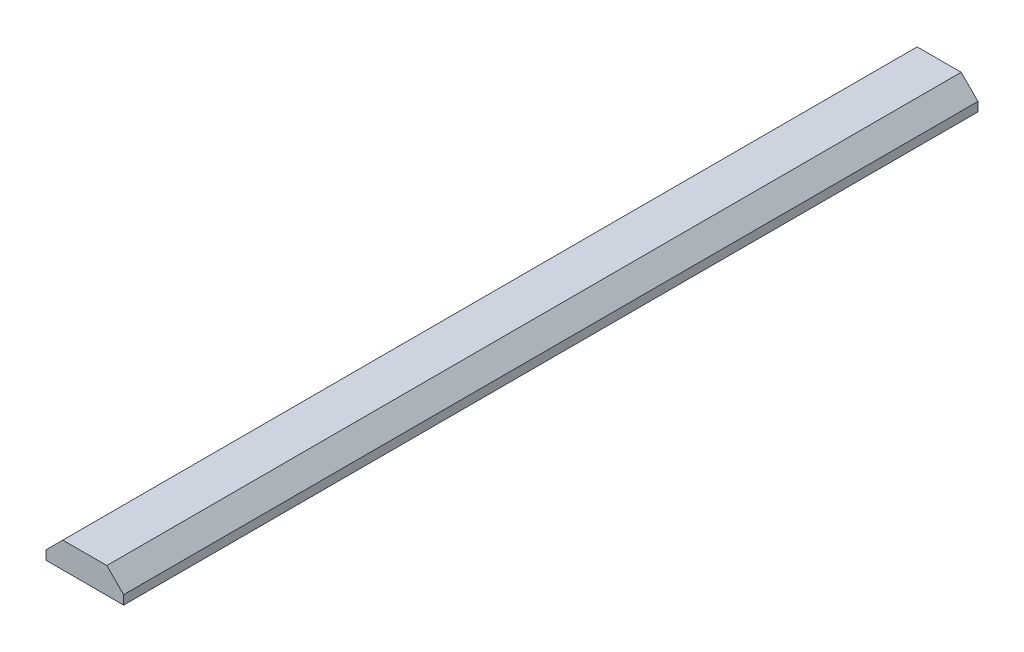
ISO-10303-21;
HEADER;
FILE_DESCRIPTION(('STEP AP214'),'2;1');
FILE_NAME('part.step','',(''),(''),'','','');
FILE_SCHEMA(('AUTOMOTIVE_DESIGN { 1 0 10303 214 1 1 1 1 }'));
ENDSEC;
DATA;
#1=APPLICATION_CONTEXT('core data for automotive mechanical design processes');
#2=APPLICATION_PROTOCOL_DEFINITION('international standard','automotive_design',2000,#1);
#3=PRODUCT_CONTEXT('',#1,'mechanical');
#4=PRODUCT('Part','Part','',(#3));
#5=PRODUCT_RELATED_PRODUCT_CATEGORY('part','',(#4));
#6=PRODUCT_DEFINITION_FORMATION('','',#4);
#7=PRODUCT_DEFINITION_CONTEXT('part definition',#1,'design');
#8=PRODUCT_DEFINITION('design','',#6,#7);
#9=PRODUCT_DEFINITION_SHAPE('','',#8);
#10=(LENGTH_UNIT() NAMED_UNIT(*) SI_UNIT(.MILLI.,.METRE.));
#11=(NAMED_UNIT(*) PLANE_ANGLE_UNIT() SI_UNIT($,.RADIAN.));
#12=(NAMED_UNIT(*) SI_UNIT($,.STERADIAN.) SOLID_ANGLE_UNIT());
#13=UNCERTAINTY_MEASURE_WITH_UNIT(LENGTH_MEASURE(1.E-05),#10,'distance_accuracy_value','');
#14=(GEOMETRIC_REPRESENTATION_CONTEXT(3) GLOBAL_UNCERTAINTY_ASSIGNED_CONTEXT((#13)) GLOBAL_UNIT_ASSIGNED_CONTEXT((#10,
#11,#12)) REPRESENTATION_CONTEXT('',''));
#15=CARTESIAN_POINT('',(0.,0.,0.));
#16=DIRECTION('',(0.,0.,1.));
#17=DIRECTION('',(1.,0.,0.));
#18=AXIS2_PLACEMENT_3D('',#15,#16,#17);
#19=CARTESIAN_POINT('',(3.4,1.80885878693797,132.));
#20=DIRECTION('',(0.707106781186549,0.707106781186546,0.));
#21=DIRECTION('',(-0.707106781186546,0.707106781186549,0.));
#22=AXIS2_PLACEMENT_3D('',#19,#20,#21);
#23=PLANE('',#22);
#24=DIRECTION('',(0.707106781186546,-0.707106781186549,0.));
#25=VECTOR('',#24,1.);
#26=CARTESIAN_POINT('',(3.4,1.80885878693797,0.));
#27=LINE('',#26,#25);
#28=CARTESIAN_POINT('',(3.4,1.80885878693797,0.));
#29=VERTEX_POINT('',#28);
#30=CARTESIAN_POINT('',(6.,-0.791141213062042,0.));
#31=VERTEX_POINT('',#30);
#32=EDGE_CURVE('E127',#29,#31,#27,.T.);
#33=ORIENTED_EDGE('',*,*,#32,.F.);
#34=DIRECTION('',(0.,0.,-1.));
#35=VECTOR('',#34,1.);
#36=CARTESIAN_POINT('',(3.4,1.80885878693797,132.));
#37=LINE('',#36,#35);
#38=CARTESIAN_POINT('',(3.4,1.80885878693797,132.));
#39=VERTEX_POINT('',#38);
#40=EDGE_CURVE('E11',#39,#29,#37,.T.);
#41=ORIENTED_EDGE('',*,*,#40,.F.);
#42=DIRECTION('',(0.707106781186546,-0.707106781186549,0.));
#43=VECTOR('',#42,1.);
#44=CARTESIAN_POINT('',(3.4,1.80885878693797,132.));
#45=LINE('',#44,#43);
#46=CARTESIAN_POINT('',(6.,-0.791141213062042,132.));
#47=VERTEX_POINT('',#46);
#48=EDGE_CURVE('E139',#39,#47,#45,.T.);
#49=ORIENTED_EDGE('',*,*,#48,.T.);
#50=DIRECTION('',(0.,0.,-1.));
#51=VECTOR('',#50,1.);
#52=CARTESIAN_POINT('',(6.,-0.791141213062042,132.));
#53=LINE('',#52,#51);
#54=EDGE_CURVE('E44',#47,#31,#53,.T.);
#55=ORIENTED_EDGE('',*,*,#54,.T.);
#56=EDGE_LOOP('',(#33,#41,#49,#55));
#57=FACE_BOUND('',#56,.T.);
#58=ADVANCED_FACE('F41',(#57),#23,.T.);
#59=CARTESIAN_POINT('',(3.4,1.80885878693797,132.));
#60=DIRECTION('',(0.,-1.,0.));
#61=DIRECTION('',(0.,0.,-1.));
#62=AXIS2_PLACEMENT_3D('',#59,#60,#61);
#63=PLANE('',#62);
#64=DIRECTION('',(-1.,0.,0.));
#65=VECTOR('',#64,1.);
#66=CARTESIAN_POINT('',(3.4,1.80885878693797,0.));
#67=LINE('',#66,#65);
#68=CARTESIAN_POINT('',(-3.4,1.80885878693797,0.));
#69=VERTEX_POINT('',#68);
#70=EDGE_CURVE('E80',#29,#69,#67,.T.);
#71=ORIENTED_EDGE('',*,*,#70,.T.);
#72=DIRECTION('',(0.,0.,-1.));
#73=VECTOR('',#72,1.);
#74=CARTESIAN_POINT('',(-3.4,1.80885878693797,132.));
#75=LINE('',#74,#73);
#76=CARTESIAN_POINT('',(-3.4,1.80885878693797,132.));
#77=VERTEX_POINT('',#76);
#78=EDGE_CURVE('E50',#77,#69,#75,.T.);
#79=ORIENTED_EDGE('',*,*,#78,.F.);
#80=DIRECTION('',(-1.,0.,0.));
#81=VECTOR('',#80,1.);
#82=CARTESIAN_POINT('',(3.4,1.80885878693797,132.));
#83=LINE('',#82,#81);
#84=EDGE_CURVE('E105',#39,#77,#83,.T.);
#85=ORIENTED_EDGE('',*,*,#84,.F.);
#86=ORIENTED_EDGE('',*,*,#40,.T.);
#87=EDGE_LOOP('',(#71,#79,#85,#86));
#88=FACE_BOUND('',#87,.T.);
#89=ADVANCED_FACE('F159',(#88),#63,.F.);
#90=CARTESIAN_POINT('',(-3.4,1.80885878693797,132.));
#91=DIRECTION('',(0.707106781186549,-0.707106781186546,0.));
#92=DIRECTION('',(0.707106781186546,0.707106781186549,0.));
#93=AXIS2_PLACEMENT_3D('',#90,#91,#92);
#94=PLANE('',#93);
#95=DIRECTION('',(-0.707106781186546,-0.707106781186549,0.));
#96=VECTOR('',#95,1.);
#97=CARTESIAN_POINT('',(-3.4,1.80885878693797,0.));
#98=LINE('',#97,#96);
#99=CARTESIAN_POINT('',(-6.,-0.791141213062042,0.));
#100=VERTEX_POINT('',#99);
#101=EDGE_CURVE('E112',#69,#100,#98,.T.);
#102=ORIENTED_EDGE('',*,*,#101,.T.);
#103=DIRECTION('',(0.,0.,-1.));
#104=VECTOR('',#103,1.);
#105=CARTESIAN_POINT('',(-6.,-0.791141213062042,132.));
#106=LINE('',#105,#104);
#107=CARTESIAN_POINT('',(-6.,-0.791141213062042,132.));
#108=VERTEX_POINT('',#107);
#109=EDGE_CURVE('E109',#108,#100,#106,.T.);
#110=ORIENTED_EDGE('',*,*,#109,.F.);
#111=DIRECTION('',(-0.707106781186546,-0.707106781186549,0.));
#112=VECTOR('',#111,1.);
#113=CARTESIAN_POINT('',(-3.4,1.80885878693797,132.));
#114=LINE('',#113,#112);
#115=EDGE_CURVE('E98',#77,#108,#114,.T.);
#116=ORIENTED_EDGE('',*,*,#115,.F.);
#117=ORIENTED_EDGE('',*,*,#78,.T.);
#118=EDGE_LOOP('',(#102,#110,#116,#117));
#119=FACE_BOUND('',#118,.T.);
#120=ADVANCED_FACE('F110',(#119),#94,.F.);
#121=CARTESIAN_POINT('',(-6.,-0.791141213062042,132.));
#122=DIRECTION('',(1.,0.,0.));
#123=DIRECTION('',(0.,0.,-1.));
#124=AXIS2_PLACEMENT_3D('',#121,#122,#123);
#125=PLANE('',#124);
#126=DIRECTION('',(0.,-1.,0.));
#127=VECTOR('',#126,1.);
#128=CARTESIAN_POINT('',(-6.,-0.791141213062042,0.));
#129=LINE('',#128,#127);
#130=CARTESIAN_POINT('',(-6.,-2.19114121306203,0.));
#131=VERTEX_POINT('',#130);
#132=EDGE_CURVE('E136',#100,#131,#129,.T.);
#133=ORIENTED_EDGE('',*,*,#132,.T.);
#134=DIRECTION('',(0.,0.,-1.));
#135=VECTOR('',#134,1.);
#136=CARTESIAN_POINT('',(-6.,-2.19114121306203,132.));
#137=LINE('',#136,#135);
#138=CARTESIAN_POINT('',(-6.,-2.19114121306203,132.));
#139=VERTEX_POINT('',#138);
#140=EDGE_CURVE('E115',#139,#131,#137,.T.);
#141=ORIENTED_EDGE('',*,*,#140,.F.);
#142=DIRECTION('',(0.,-1.,0.));
#143=VECTOR('',#142,1.);
#144=CARTESIAN_POINT('',(-6.,-0.791141213062042,132.));
#145=LINE('',#144,#143);
#146=EDGE_CURVE('E103',#108,#139,#145,.T.);
#147=ORIENTED_EDGE('',*,*,#146,.F.);
#148=ORIENTED_EDGE('',*,*,#109,.T.);
#149=EDGE_LOOP('',(#133,#141,#147,#148));
#150=FACE_BOUND('',#149,.T.);
#151=ADVANCED_FACE('F117',(#150),#125,.F.);
#152=CARTESIAN_POINT('',(-6.,-2.19114121306203,132.));
#153=DIRECTION('',(0.,1.,0.));
#154=DIRECTION('',(0.,0.,1.));
#155=AXIS2_PLACEMENT_3D('',#152,#153,#154);
#156=PLANE('',#155);
#157=DIRECTION('',(1.,0.,0.));
#158=VECTOR('',#157,1.);
#159=CARTESIAN_POINT('',(-6.,-2.19114121306203,0.));
#160=LINE('',#159,#158);
#161=CARTESIAN_POINT('',(6.,-2.19114121306203,0.));
#162=VERTEX_POINT('',#161);
#163=EDGE_CURVE('E133',#131,#162,#160,.T.);
#164=ORIENTED_EDGE('',*,*,#163,.T.);
#165=DIRECTION('',(0.,0.,-1.));
#166=VECTOR('',#165,1.);
#167=CARTESIAN_POINT('',(6.,-2.19114121306203,132.));
#168=LINE('',#167,#166);
#169=CARTESIAN_POINT('',(6.,-2.19114121306203,132.));
#170=VERTEX_POINT('',#169);
#171=EDGE_CURVE('E142',#170,#162,#168,.T.);
#172=ORIENTED_EDGE('',*,*,#171,.F.);
#173=DIRECTION('',(1.,0.,0.));
#174=VECTOR('',#173,1.);
#175=CARTESIAN_POINT('',(-6.,-2.19114121306203,132.));
#176=LINE('',#175,#174);
#177=EDGE_CURVE('E120',#139,#170,#176,.T.);
#178=ORIENTED_EDGE('',*,*,#177,.F.);
#179=ORIENTED_EDGE('',*,*,#140,.T.);
#180=EDGE_LOOP('',(#164,#172,#178,#179));
#181=FACE_BOUND('',#180,.T.);
#182=ADVANCED_FACE('F149',(#181),#156,.F.);
#183=CARTESIAN_POINT('',(6.,-0.791141213062042,132.));
#184=DIRECTION('',(1.,0.,0.));
#185=DIRECTION('',(0.,0.,-1.));
#186=AXIS2_PLACEMENT_3D('',#183,#184,#185);
#187=PLANE('',#186);
#188=DIRECTION('',(0.,-1.,0.));
#189=VECTOR('',#188,1.);
#190=CARTESIAN_POINT('',(6.,-0.791141213062042,0.));
#191=LINE('',#190,#189);
#192=EDGE_CURVE('E130',#31,#162,#191,.T.);
#193=ORIENTED_EDGE('',*,*,#192,.F.);
#194=ORIENTED_EDGE('',*,*,#54,.F.);
#195=DIRECTION('',(0.,-1.,0.));
#196=VECTOR('',#195,1.);
#197=CARTESIAN_POINT('',(6.,-0.791141213062042,132.));
#198=LINE('',#197,#196);
#199=EDGE_CURVE('E122',#47,#170,#198,.T.);
#200=ORIENTED_EDGE('',*,*,#199,.T.);
#201=ORIENTED_EDGE('',*,*,#171,.T.);
#202=EDGE_LOOP('',(#193,#194,#200,#201));
#203=FACE_BOUND('',#202,.T.);
#204=ADVANCED_FACE('F144',(#203),#187,.T.);
#205=CARTESIAN_POINT('',(0.,0.,132.));
#206=DIRECTION('',(0.,0.,-1.));
#207=DIRECTION('',(-1.,0.,0.));
#208=AXIS2_PLACEMENT_3D('',#205,#206,#207);
#209=PLANE('',#208);
#210=ORIENTED_EDGE('',*,*,#48,.F.);
#211=ORIENTED_EDGE('',*,*,#84,.T.);
#212=ORIENTED_EDGE('',*,*,#115,.T.);
#213=ORIENTED_EDGE('',*,*,#146,.T.);
#214=ORIENTED_EDGE('',*,*,#177,.T.);
#215=ORIENTED_EDGE('',*,*,#199,.F.);
#216=EDGE_LOOP('',(#210,#211,#212,#213,#214,#215));
#217=FACE_BOUND('',#216,.T.);
#218=ADVANCED_FACE('F101',(#217),#209,.F.);
#219=CARTESIAN_POINT('',(0.,0.,0.));
#220=DIRECTION('',(0.,0.,-1.));
#221=DIRECTION('',(-1.,0.,0.));
#222=AXIS2_PLACEMENT_3D('',#219,#220,#221);
#223=PLANE('',#222);
#224=ORIENTED_EDGE('',*,*,#32,.T.);
#225=ORIENTED_EDGE('',*,*,#192,.T.);
#226=ORIENTED_EDGE('',*,*,#163,.F.);
#227=ORIENTED_EDGE('',*,*,#132,.F.);
#228=ORIENTED_EDGE('',*,*,#101,.F.);
#229=ORIENTED_EDGE('',*,*,#70,.F.);
#230=EDGE_LOOP('',(#224,#225,#226,#227,#228,#229));
#231=FACE_BOUND('',#230,.T.);
#232=ADVANCED_FACE('F147',(#231),#223,.T.);
#233=CLOSED_SHELL('',(#58,#89,#120,#151,#182,#204,#218,#232));
#234=MANIFOLD_SOLID_BREP('B2',#233);
#235=ADVANCED_BREP_SHAPE_REPRESENTATION('',(#18,#234),#14);
#236=SHAPE_DEFINITION_REPRESENTATION(#9,#235);
ENDSEC;
END-ISO-10303-21;
